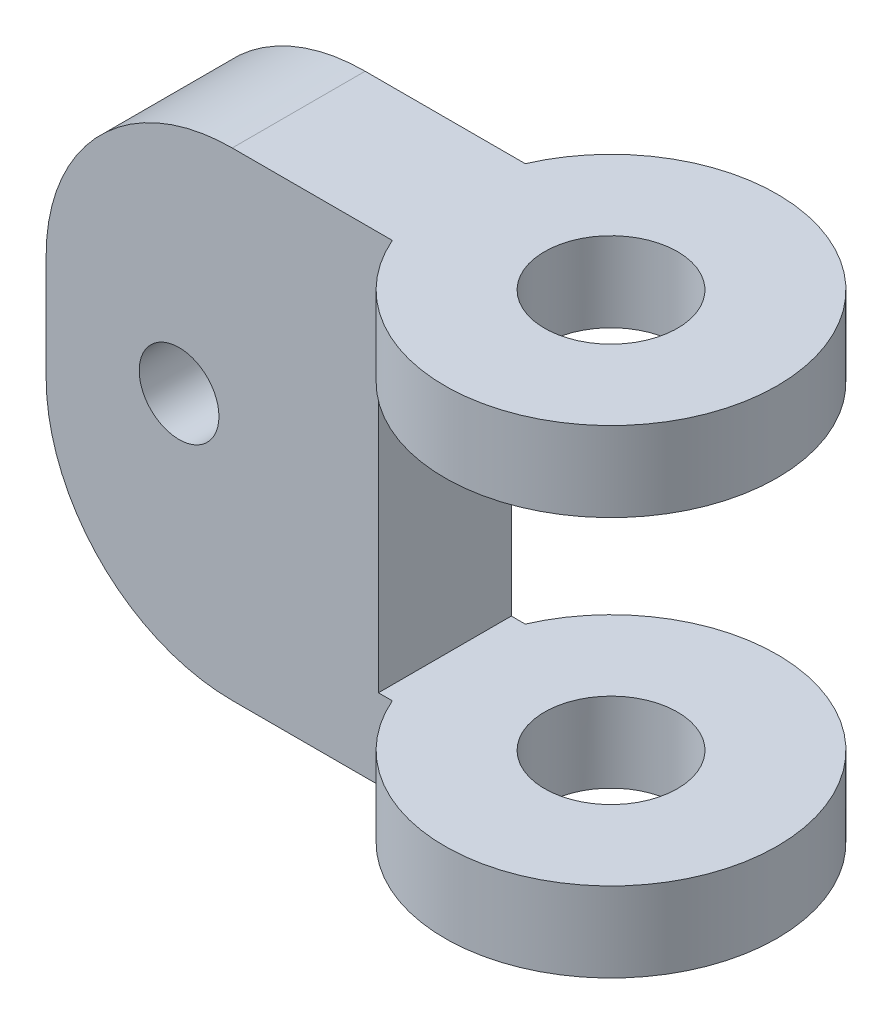
ISO-10303-21;
HEADER;
FILE_DESCRIPTION(('STEP AP214'),'2;1');
FILE_NAME('part.step','',(''),(''),'','','');
FILE_SCHEMA(('AUTOMOTIVE_DESIGN { 1 0 10303 214 1 1 1 1 }'));
ENDSEC;
DATA;
#1=APPLICATION_CONTEXT('core data for automotive mechanical design processes');
#2=APPLICATION_PROTOCOL_DEFINITION('international standard','automotive_design',2000,#1);
#3=PRODUCT_CONTEXT('',#1,'mechanical');
#4=PRODUCT('Part','Part','',(#3));
#5=PRODUCT_RELATED_PRODUCT_CATEGORY('part','',(#4));
#6=PRODUCT_DEFINITION_FORMATION('','',#4);
#7=PRODUCT_DEFINITION_CONTEXT('part definition',#1,'design');
#8=PRODUCT_DEFINITION('design','',#6,#7);
#9=PRODUCT_DEFINITION_SHAPE('','',#8);
#10=(LENGTH_UNIT() NAMED_UNIT(*) SI_UNIT(.MILLI.,.METRE.));
#11=(NAMED_UNIT(*) PLANE_ANGLE_UNIT() SI_UNIT($,.RADIAN.));
#12=(NAMED_UNIT(*) SI_UNIT($,.STERADIAN.) SOLID_ANGLE_UNIT());
#13=UNCERTAINTY_MEASURE_WITH_UNIT(LENGTH_MEASURE(1.E-05),#10,'distance_accuracy_value','');
#14=(GEOMETRIC_REPRESENTATION_CONTEXT(3) GLOBAL_UNCERTAINTY_ASSIGNED_CONTEXT((#13)) GLOBAL_UNIT_ASSIGNED_CONTEXT((#10,
#11,#12)) REPRESENTATION_CONTEXT('',''));
#15=CARTESIAN_POINT('',(0.,0.,0.));
#16=DIRECTION('',(0.,0.,1.));
#17=DIRECTION('',(1.,0.,0.));
#18=AXIS2_PLACEMENT_3D('',#15,#16,#17);
#19=CARTESIAN_POINT('',(5.75000000000005,17.1,15.));
#20=DIRECTION('',(0.,-1.,0.));
#21=DIRECTION('',(0.,0.,-1.));
#22=AXIS2_PLACEMENT_3D('',#19,#20,#21);
#23=PLANE('',#22);
#24=CARTESIAN_POINT('',(17.5,17.1,7.5));
#25=DIRECTION('',(0.,-1.,0.));
#26=DIRECTION('',(0.,0.,-1.));
#27=AXIS2_PLACEMENT_3D('',#24,#25,#26);
#28=CIRCLE('',#27,2.5);
#29=CARTESIAN_POINT('',(17.5,17.1,5.));
#30=VERTEX_POINT('',#29);
#31=EDGE_CURVE('E182',#30,#30,#28,.F.);
#32=ORIENTED_EDGE('',*,*,#31,.F.);
#33=EDGE_LOOP('',(#32));
#34=FACE_BOUND('',#33,.T.);
#35=CARTESIAN_POINT('',(17.5,17.1,7.5));
#36=DIRECTION('',(0.,-1.,0.));
#37=DIRECTION('',(0.,0.,-1.));
#38=AXIS2_PLACEMENT_3D('',#35,#36,#37);
#39=CIRCLE('',#38,6.25);
#40=CARTESIAN_POINT('',(11.7717803813052,17.1,5.));
#41=VERTEX_POINT('',#40);
#42=CARTESIAN_POINT('',(11.7717803813052,17.1,10.));
#43=VERTEX_POINT('',#42);
#44=EDGE_CURVE('E111',#41,#43,#39,.T.);
#45=ORIENTED_EDGE('',*,*,#44,.F.);
#46=DIRECTION('',(1.,0.,0.));
#47=VECTOR('',#46,1.);
#48=CARTESIAN_POINT('',(0.,17.1,5.));
#49=LINE('',#48,#47);
#50=CARTESIAN_POINT('',(5.75,17.1,5.));
#51=VERTEX_POINT('',#50);
#52=EDGE_CURVE('E115',#51,#41,#49,.T.);
#53=ORIENTED_EDGE('',*,*,#52,.F.);
#54=DIRECTION('',(0.,0.,-1.));
#55=VECTOR('',#54,1.);
#56=CARTESIAN_POINT('',(5.75000000000005,17.1,15.));
#57=LINE('',#56,#55);
#58=CARTESIAN_POINT('',(5.75,17.1,10.));
#59=VERTEX_POINT('',#58);
#60=EDGE_CURVE('E12',#59,#51,#57,.T.);
#61=ORIENTED_EDGE('',*,*,#60,.F.);
#62=DIRECTION('',(1.,0.,0.));
#63=VECTOR('',#62,1.);
#64=CARTESIAN_POINT('',(0.,17.1,10.));
#65=LINE('',#64,#63);
#66=EDGE_CURVE('E116',#59,#43,#65,.T.);
#67=ORIENTED_EDGE('',*,*,#66,.T.);
#68=EDGE_LOOP('',(#45,#53,#61,#67));
#69=FACE_BOUND('',#68,.T.);
#70=ADVANCED_FACE('F33',(#34,#69),#23,.F.);
#71=CARTESIAN_POINT('',(11.25,-0.9,15.));
#72=DIRECTION('',(0.,1.,0.));
#73=DIRECTION('',(-1.,0.,0.));
#74=AXIS2_PLACEMENT_3D('',#71,#72,#73);
#75=PLANE('',#74);
#76=CARTESIAN_POINT('',(17.5,-0.900000000000001,7.5));
#77=DIRECTION('',(0.,1.,0.));
#78=DIRECTION('',(-1.,0.,0.));
#79=AXIS2_PLACEMENT_3D('',#76,#77,#78);
#80=CIRCLE('',#79,2.5);
#81=CARTESIAN_POINT('',(15.,-0.900000000000001,7.5));
#82=VERTEX_POINT('',#81);
#83=EDGE_CURVE('E179',#82,#82,#80,.F.);
#84=ORIENTED_EDGE('',*,*,#83,.F.);
#85=EDGE_LOOP('',(#84));
#86=FACE_BOUND('',#85,.T.);
#87=DIRECTION('',(1.,0.,0.));
#88=VECTOR('',#87,1.);
#89=CARTESIAN_POINT('',(11.25,-0.9,5.));
#90=LINE('',#89,#88);
#91=CARTESIAN_POINT('',(5.75000000000005,-0.9,5.));
#92=VERTEX_POINT('',#91);
#93=CARTESIAN_POINT('',(11.7717803813052,-0.9,5.));
#94=VERTEX_POINT('',#93);
#95=EDGE_CURVE('E151',#92,#94,#90,.T.);
#96=ORIENTED_EDGE('',*,*,#95,.T.);
#97=CARTESIAN_POINT('',(17.5,-0.900000000000001,7.5));
#98=DIRECTION('',(0.,1.,0.));
#99=DIRECTION('',(-1.,0.,0.));
#100=AXIS2_PLACEMENT_3D('',#97,#98,#99);
#101=CIRCLE('',#100,6.25);
#102=CARTESIAN_POINT('',(11.7717803813052,-0.9,10.));
#103=VERTEX_POINT('',#102);
#104=EDGE_CURVE('E121',#103,#94,#101,.T.);
#105=ORIENTED_EDGE('',*,*,#104,.F.);
#106=DIRECTION('',(1.,0.,0.));
#107=VECTOR('',#106,1.);
#108=CARTESIAN_POINT('',(11.25,-0.9,10.));
#109=LINE('',#108,#107);
#110=CARTESIAN_POINT('',(5.75000000000005,-0.9,10.));
#111=VERTEX_POINT('',#110);
#112=EDGE_CURVE('E170',#111,#103,#109,.T.);
#113=ORIENTED_EDGE('',*,*,#112,.F.);
#114=DIRECTION('',(0.,0.,-1.));
#115=VECTOR('',#114,1.);
#116=CARTESIAN_POINT('',(5.75000000000005,-0.9,15.));
#117=LINE('',#116,#115);
#118=EDGE_CURVE('E191',#111,#92,#117,.T.);
#119=ORIENTED_EDGE('',*,*,#118,.T.);
#120=EDGE_LOOP('',(#96,#105,#113,#119));
#121=FACE_BOUND('',#120,.T.);
#122=ADVANCED_FACE('F242',(#86,#121),#75,.F.);
#123=CARTESIAN_POINT('',(23.75,2.1,15.));
#124=DIRECTION('',(0.,-1.,0.));
#125=DIRECTION('',(1.,0.,0.));
#126=AXIS2_PLACEMENT_3D('',#123,#124,#125);
#127=PLANE('',#126);
#128=CARTESIAN_POINT('',(17.5,2.1,7.5));
#129=DIRECTION('',(0.,-1.,0.));
#130=DIRECTION('',(1.,0.,0.));
#131=AXIS2_PLACEMENT_3D('',#128,#129,#130);
#132=CIRCLE('',#131,2.5);
#133=CARTESIAN_POINT('',(20.,2.1,7.5));
#134=VERTEX_POINT('',#133);
#135=EDGE_CURVE('E176',#134,#134,#132,.F.);
#136=ORIENTED_EDGE('',*,*,#135,.F.);
#137=EDGE_LOOP('',(#136));
#138=FACE_BOUND('',#137,.T.);
#139=CARTESIAN_POINT('',(17.5,2.1,7.5));
#140=DIRECTION('',(0.,-1.,0.));
#141=DIRECTION('',(1.,0.,0.));
#142=AXIS2_PLACEMENT_3D('',#139,#140,#141);
#143=CIRCLE('',#142,6.25);
#144=CARTESIAN_POINT('',(11.7717803813052,2.1,5.));
#145=VERTEX_POINT('',#144);
#146=CARTESIAN_POINT('',(11.7717803813052,2.1,10.));
#147=VERTEX_POINT('',#146);
#148=EDGE_CURVE('E172',#145,#147,#143,.T.);
#149=ORIENTED_EDGE('',*,*,#148,.F.);
#150=DIRECTION('',(-1.,0.,0.));
#151=VECTOR('',#150,1.);
#152=CARTESIAN_POINT('',(23.75,2.1,5.));
#153=LINE('',#152,#151);
#154=CARTESIAN_POINT('',(11.25,2.1,5.));
#155=VERTEX_POINT('',#154);
#156=EDGE_CURVE('E141',#145,#155,#153,.T.);
#157=ORIENTED_EDGE('',*,*,#156,.T.);
#158=DIRECTION('',(0.,0.,-1.));
#159=VECTOR('',#158,1.);
#160=CARTESIAN_POINT('',(11.25,2.1,15.));
#161=LINE('',#160,#159);
#162=CARTESIAN_POINT('',(11.25,2.1,10.));
#163=VERTEX_POINT('',#162);
#164=EDGE_CURVE('E188',#163,#155,#161,.T.);
#165=ORIENTED_EDGE('',*,*,#164,.F.);
#166=DIRECTION('',(-1.,0.,0.));
#167=VECTOR('',#166,1.);
#168=CARTESIAN_POINT('',(23.75,2.1,10.));
#169=LINE('',#168,#167);
#170=EDGE_CURVE('E164',#147,#163,#169,.T.);
#171=ORIENTED_EDGE('',*,*,#170,.F.);
#172=EDGE_LOOP('',(#149,#157,#165,#171));
#173=FACE_BOUND('',#172,.T.);
#174=ADVANCED_FACE('F211',(#138,#173),#127,.F.);
#175=CARTESIAN_POINT('',(23.75,14.1,15.));
#176=DIRECTION('',(0.,1.,0.));
#177=DIRECTION('',(-1.,0.,0.));
#178=AXIS2_PLACEMENT_3D('',#175,#176,#177);
#179=PLANE('',#178);
#180=CARTESIAN_POINT('',(17.5,14.1,7.5));
#181=DIRECTION('',(0.,1.,0.));
#182=DIRECTION('',(-1.,0.,0.));
#183=AXIS2_PLACEMENT_3D('',#180,#181,#182);
#184=CIRCLE('',#183,2.5);
#185=CARTESIAN_POINT('',(15.,14.1,7.5));
#186=VERTEX_POINT('',#185);
#187=EDGE_CURVE('E120',#186,#186,#184,.F.);
#188=ORIENTED_EDGE('',*,*,#187,.F.);
#189=EDGE_LOOP('',(#188));
#190=FACE_BOUND('',#189,.T.);
#191=DIRECTION('',(1.,0.,0.));
#192=VECTOR('',#191,1.);
#193=CARTESIAN_POINT('',(23.75,14.1,5.));
#194=LINE('',#193,#192);
#195=CARTESIAN_POINT('',(11.25,14.1,5.));
#196=VERTEX_POINT('',#195);
#197=CARTESIAN_POINT('',(11.7717803813052,14.1,5.));
#198=VERTEX_POINT('',#197);
#199=EDGE_CURVE('E139',#196,#198,#194,.T.);
#200=ORIENTED_EDGE('',*,*,#199,.T.);
#201=CARTESIAN_POINT('',(17.5,14.1,7.5));
#202=DIRECTION('',(0.,1.,0.));
#203=DIRECTION('',(-1.,0.,0.));
#204=AXIS2_PLACEMENT_3D('',#201,#202,#203);
#205=CIRCLE('',#204,6.25);
#206=CARTESIAN_POINT('',(11.7717803813052,14.1,10.));
#207=VERTEX_POINT('',#206);
#208=EDGE_CURVE('E126',#207,#198,#205,.T.);
#209=ORIENTED_EDGE('',*,*,#208,.F.);
#210=DIRECTION('',(1.,0.,0.));
#211=VECTOR('',#210,1.);
#212=CARTESIAN_POINT('',(23.75,14.1,10.));
#213=LINE('',#212,#211);
#214=CARTESIAN_POINT('',(11.25,14.1,10.));
#215=VERTEX_POINT('',#214);
#216=EDGE_CURVE('E160',#215,#207,#213,.T.);
#217=ORIENTED_EDGE('',*,*,#216,.F.);
#218=DIRECTION('',(0.,0.,-1.));
#219=VECTOR('',#218,1.);
#220=CARTESIAN_POINT('',(11.25,14.1,15.));
#221=LINE('',#220,#219);
#222=EDGE_CURVE('E185',#215,#196,#221,.T.);
#223=ORIENTED_EDGE('',*,*,#222,.T.);
#224=EDGE_LOOP('',(#200,#209,#217,#223));
#225=FACE_BOUND('',#224,.T.);
#226=ADVANCED_FACE('F218',(#190,#225),#179,.F.);
#227=CARTESIAN_POINT('',(5.75,10.1,15.));
#228=DIRECTION('',(0.,0.,-1.));
#229=DIRECTION('',(-1.,0.,0.));
#230=AXIS2_PLACEMENT_3D('',#227,#228,#229);
#231=CYLINDRICAL_SURFACE('',#230,7.);
#232=ORIENTED_EDGE('',*,*,#60,.T.);
#233=CARTESIAN_POINT('',(5.75,10.1,5.));
#234=DIRECTION('',(0.,0.,1.));
#235=DIRECTION('',(1.,0.,0.));
#236=AXIS2_PLACEMENT_3D('',#233,#234,#235);
#237=CIRCLE('',#236,7.);
#238=CARTESIAN_POINT('',(-1.25,10.1,5.));
#239=VERTEX_POINT('',#238);
#240=EDGE_CURVE('E133',#51,#239,#237,.T.);
#241=ORIENTED_EDGE('',*,*,#240,.T.);
#242=DIRECTION('',(0.,0.,-1.));
#243=VECTOR('',#242,1.);
#244=CARTESIAN_POINT('',(-1.25,10.1,15.));
#245=LINE('',#244,#243);
#246=CARTESIAN_POINT('',(-1.25,10.1,10.));
#247=VERTEX_POINT('',#246);
#248=EDGE_CURVE('E41',#247,#239,#245,.T.);
#249=ORIENTED_EDGE('',*,*,#248,.F.);
#250=CARTESIAN_POINT('',(5.75,10.1,10.));
#251=DIRECTION('',(0.,0.,1.));
#252=DIRECTION('',(1.,0.,0.));
#253=AXIS2_PLACEMENT_3D('',#250,#251,#252);
#254=CIRCLE('',#253,7.);
#255=EDGE_CURVE('E49',#59,#247,#254,.T.);
#256=ORIENTED_EDGE('',*,*,#255,.F.);
#257=EDGE_LOOP('',(#232,#241,#249,#256));
#258=FACE_BOUND('',#257,.T.);
#259=ADVANCED_FACE('F265',(#258),#231,.T.);
#260=CARTESIAN_POINT('',(-1.25,6.10000000000005,15.));
#261=DIRECTION('',(1.,0.,0.));
#262=DIRECTION('',(0.,0.,-1.));
#263=AXIS2_PLACEMENT_3D('',#260,#261,#262);
#264=PLANE('',#263);
#265=ORIENTED_EDGE('',*,*,#248,.T.);
#266=DIRECTION('',(0.,-1.,0.));
#267=VECTOR('',#266,1.);
#268=CARTESIAN_POINT('',(-1.25,6.10000000000005,5.));
#269=LINE('',#268,#267);
#270=CARTESIAN_POINT('',(-1.25,6.10000000000005,5.));
#271=VERTEX_POINT('',#270);
#272=EDGE_CURVE('E147',#239,#271,#269,.T.);
#273=ORIENTED_EDGE('',*,*,#272,.T.);
#274=DIRECTION('',(0.,0.,-1.));
#275=VECTOR('',#274,1.);
#276=CARTESIAN_POINT('',(-1.25,6.10000000000005,15.));
#277=LINE('',#276,#275);
#278=CARTESIAN_POINT('',(-1.25,6.10000000000005,10.));
#279=VERTEX_POINT('',#278);
#280=EDGE_CURVE('E194',#279,#271,#277,.T.);
#281=ORIENTED_EDGE('',*,*,#280,.F.);
#282=DIRECTION('',(0.,-1.,0.));
#283=VECTOR('',#282,1.);
#284=CARTESIAN_POINT('',(-1.25,6.10000000000005,10.));
#285=LINE('',#284,#283);
#286=EDGE_CURVE('E167',#247,#279,#285,.T.);
#287=ORIENTED_EDGE('',*,*,#286,.F.);
#288=EDGE_LOOP('',(#265,#273,#281,#287));
#289=FACE_BOUND('',#288,.T.);
#290=ADVANCED_FACE('F262',(#289),#264,.F.);
#291=CARTESIAN_POINT('',(5.75,6.1,15.));
#292=DIRECTION('',(0.,0.,-1.));
#293=DIRECTION('',(-1.,0.,0.));
#294=AXIS2_PLACEMENT_3D('',#291,#292,#293);
#295=CYLINDRICAL_SURFACE('',#294,7.);
#296=ORIENTED_EDGE('',*,*,#280,.T.);
#297=CARTESIAN_POINT('',(5.75,6.1,5.));
#298=DIRECTION('',(0.,0.,1.));
#299=DIRECTION('',(1.,0.,0.));
#300=AXIS2_PLACEMENT_3D('',#297,#298,#299);
#301=CIRCLE('',#300,7.);
#302=EDGE_CURVE('E144',#271,#92,#301,.T.);
#303=ORIENTED_EDGE('',*,*,#302,.T.);
#304=ORIENTED_EDGE('',*,*,#118,.F.);
#305=CARTESIAN_POINT('',(5.75,6.1,10.));
#306=DIRECTION('',(0.,0.,1.));
#307=DIRECTION('',(1.,0.,0.));
#308=AXIS2_PLACEMENT_3D('',#305,#306,#307);
#309=CIRCLE('',#308,7.);
#310=EDGE_CURVE('E55',#279,#111,#309,.T.);
#311=ORIENTED_EDGE('',*,*,#310,.F.);
#312=EDGE_LOOP('',(#296,#303,#304,#311));
#313=FACE_BOUND('',#312,.T.);
#314=ADVANCED_FACE('F238',(#313),#295,.T.);
#315=CARTESIAN_POINT('',(11.25,14.1,15.));
#316=DIRECTION('',(-1.,0.,0.));
#317=DIRECTION('',(0.,0.,1.));
#318=AXIS2_PLACEMENT_3D('',#315,#316,#317);
#319=PLANE('',#318);
#320=ORIENTED_EDGE('',*,*,#164,.T.);
#321=DIRECTION('',(0.,1.,0.));
#322=VECTOR('',#321,1.);
#323=CARTESIAN_POINT('',(11.25,14.1,5.));
#324=LINE('',#323,#322);
#325=EDGE_CURVE('E136',#155,#196,#324,.T.);
#326=ORIENTED_EDGE('',*,*,#325,.T.);
#327=ORIENTED_EDGE('',*,*,#222,.F.);
#328=DIRECTION('',(0.,1.,0.));
#329=VECTOR('',#328,1.);
#330=CARTESIAN_POINT('',(11.25,14.1,10.));
#331=LINE('',#330,#329);
#332=EDGE_CURVE('E158',#163,#215,#331,.T.);
#333=ORIENTED_EDGE('',*,*,#332,.F.);
#334=EDGE_LOOP('',(#320,#326,#327,#333));
#335=FACE_BOUND('',#334,.T.);
#336=ADVANCED_FACE('F214',(#335),#319,.F.);
#337=CARTESIAN_POINT('',(3.75,8.1,15.));
#338=DIRECTION('',(0.,0.,-1.));
#339=DIRECTION('',(-1.,0.,0.));
#340=AXIS2_PLACEMENT_3D('',#337,#338,#339);
#341=CYLINDRICAL_SURFACE('',#340,1.5);
#342=CARTESIAN_POINT('',(3.75,8.1,5.));
#343=DIRECTION('',(0.,0.,1.));
#344=DIRECTION('',(1.,0.,0.));
#345=AXIS2_PLACEMENT_3D('',#342,#343,#344);
#346=CIRCLE('',#345,1.5);
#347=CARTESIAN_POINT('',(5.25,8.1,5.));
#348=VERTEX_POINT('',#347);
#349=EDGE_CURVE('E36',#348,#348,#346,.T.);
#350=ORIENTED_EDGE('',*,*,#349,.F.);
#351=EDGE_LOOP('',(#350));
#352=FACE_BOUND('',#351,.T.);
#353=CARTESIAN_POINT('',(3.75,8.1,10.));
#354=DIRECTION('',(0.,0.,1.));
#355=DIRECTION('',(1.,0.,0.));
#356=AXIS2_PLACEMENT_3D('',#353,#354,#355);
#357=CIRCLE('',#356,1.5);
#358=CARTESIAN_POINT('',(5.25,8.1,10.));
#359=VERTEX_POINT('',#358);
#360=EDGE_CURVE('E161',#359,#359,#357,.T.);
#361=ORIENTED_EDGE('',*,*,#360,.T.);
#362=EDGE_LOOP('',(#361));
#363=FACE_BOUND('',#362,.T.);
#364=ADVANCED_FACE('F226',(#352,#363),#341,.F.);
#365=CARTESIAN_POINT('',(17.5,20.,7.5));
#366=DIRECTION('',(0.,-1.,0.));
#367=DIRECTION('',(0.,0.,-1.));
#368=AXIS2_PLACEMENT_3D('',#365,#366,#367);
#369=CYLINDRICAL_SURFACE('',#368,2.5);
#370=ORIENTED_EDGE('',*,*,#187,.T.);
#371=EDGE_LOOP('',(#370));
#372=FACE_BOUND('',#371,.T.);
#373=ORIENTED_EDGE('',*,*,#31,.T.);
#374=EDGE_LOOP('',(#373));
#375=FACE_BOUND('',#374,.T.);
#376=ADVANCED_FACE('F228',(#372,#375),#369,.F.);
#377=ORIENTED_EDGE('',*,*,#135,.T.);
#378=EDGE_LOOP('',(#377));
#379=FACE_BOUND('',#378,.T.);
#380=ORIENTED_EDGE('',*,*,#83,.T.);
#381=EDGE_LOOP('',(#380));
#382=FACE_BOUND('',#381,.T.);
#383=ADVANCED_FACE('F235',(#379,#382),#369,.F.);
#384=CARTESIAN_POINT('',(17.5,20.,7.5));
#385=DIRECTION('',(0.,-1.,0.));
#386=DIRECTION('',(0.,0.,-1.));
#387=AXIS2_PLACEMENT_3D('',#384,#385,#386);
#388=CYLINDRICAL_SURFACE('',#387,6.25);
#389=ORIENTED_EDGE('',*,*,#104,.T.);
#390=DIRECTION('',(0.,1.,0.));
#391=VECTOR('',#390,1.);
#392=CARTESIAN_POINT('',(11.7717803813052,-4.9,5.));
#393=LINE('',#392,#391);
#394=EDGE_CURVE('E129',#94,#145,#393,.T.);
#395=ORIENTED_EDGE('',*,*,#394,.T.);
#396=ORIENTED_EDGE('',*,*,#148,.T.);
#397=DIRECTION('',(0.,1.,0.));
#398=VECTOR('',#397,1.);
#399=CARTESIAN_POINT('',(11.7717803813052,-4.9,10.));
#400=LINE('',#399,#398);
#401=EDGE_CURVE('E157',#103,#147,#400,.T.);
#402=ORIENTED_EDGE('',*,*,#401,.F.);
#403=EDGE_LOOP('',(#389,#395,#396,#402));
#404=FACE_BOUND('',#403,.T.);
#405=ADVANCED_FACE('F221',(#404),#388,.T.);
#406=ORIENTED_EDGE('',*,*,#44,.T.);
#407=EDGE_CURVE('E155',#207,#43,#400,.T.);
#408=ORIENTED_EDGE('',*,*,#407,.F.);
#409=ORIENTED_EDGE('',*,*,#208,.T.);
#410=EDGE_CURVE('E124',#198,#41,#393,.T.);
#411=ORIENTED_EDGE('',*,*,#410,.T.);
#412=EDGE_LOOP('',(#406,#408,#409,#411));
#413=FACE_BOUND('',#412,.T.);
#414=ADVANCED_FACE('F125',(#413),#388,.T.);
#415=CARTESIAN_POINT('',(0.,-4.9,10.));
#416=DIRECTION('',(0.,0.,1.));
#417=DIRECTION('',(1.,0.,0.));
#418=AXIS2_PLACEMENT_3D('',#415,#416,#417);
#419=PLANE('',#418);
#420=ORIENTED_EDGE('',*,*,#360,.F.);
#421=EDGE_LOOP('',(#420));
#422=FACE_BOUND('',#421,.T.);
#423=ORIENTED_EDGE('',*,*,#112,.T.);
#424=ORIENTED_EDGE('',*,*,#401,.T.);
#425=ORIENTED_EDGE('',*,*,#170,.T.);
#426=ORIENTED_EDGE('',*,*,#332,.T.);
#427=ORIENTED_EDGE('',*,*,#216,.T.);
#428=ORIENTED_EDGE('',*,*,#407,.T.);
#429=ORIENTED_EDGE('',*,*,#66,.F.);
#430=ORIENTED_EDGE('',*,*,#255,.T.);
#431=ORIENTED_EDGE('',*,*,#286,.T.);
#432=ORIENTED_EDGE('',*,*,#310,.T.);
#433=EDGE_LOOP('',(#423,#424,#425,#426,#427,#428,#429,#430,#431,#432));
#434=FACE_BOUND('',#433,.T.);
#435=ADVANCED_FACE('F206',(#422,#434),#419,.T.);
#436=CARTESIAN_POINT('',(0.,-4.9,5.));
#437=DIRECTION('',(0.,0.,1.));
#438=DIRECTION('',(1.,0.,0.));
#439=AXIS2_PLACEMENT_3D('',#436,#437,#438);
#440=PLANE('',#439);
#441=ORIENTED_EDGE('',*,*,#349,.T.);
#442=EDGE_LOOP('',(#441));
#443=FACE_BOUND('',#442,.T.);
#444=ORIENTED_EDGE('',*,*,#302,.F.);
#445=ORIENTED_EDGE('',*,*,#272,.F.);
#446=ORIENTED_EDGE('',*,*,#240,.F.);
#447=ORIENTED_EDGE('',*,*,#52,.T.);
#448=ORIENTED_EDGE('',*,*,#410,.F.);
#449=ORIENTED_EDGE('',*,*,#199,.F.);
#450=ORIENTED_EDGE('',*,*,#325,.F.);
#451=ORIENTED_EDGE('',*,*,#156,.F.);
#452=ORIENTED_EDGE('',*,*,#394,.F.);
#453=ORIENTED_EDGE('',*,*,#95,.F.);
#454=EDGE_LOOP('',(#444,#445,#446,#447,#448,#449,#450,#451,#452,#453));
#455=FACE_BOUND('',#454,.T.);
#456=ADVANCED_FACE('F131',(#443,#455),#440,.F.);
#457=CLOSED_SHELL('',(#70,#122,#174,#226,#259,#290,#314,#336,#364,#376,#383,#405,#414,#435,#456));
#458=MANIFOLD_SOLID_BREP('B2',#457);
#459=ADVANCED_BREP_SHAPE_REPRESENTATION('',(#18,#458),#14);
#460=SHAPE_DEFINITION_REPRESENTATION(#9,#459);
ENDSEC;
END-ISO-10303-21;
